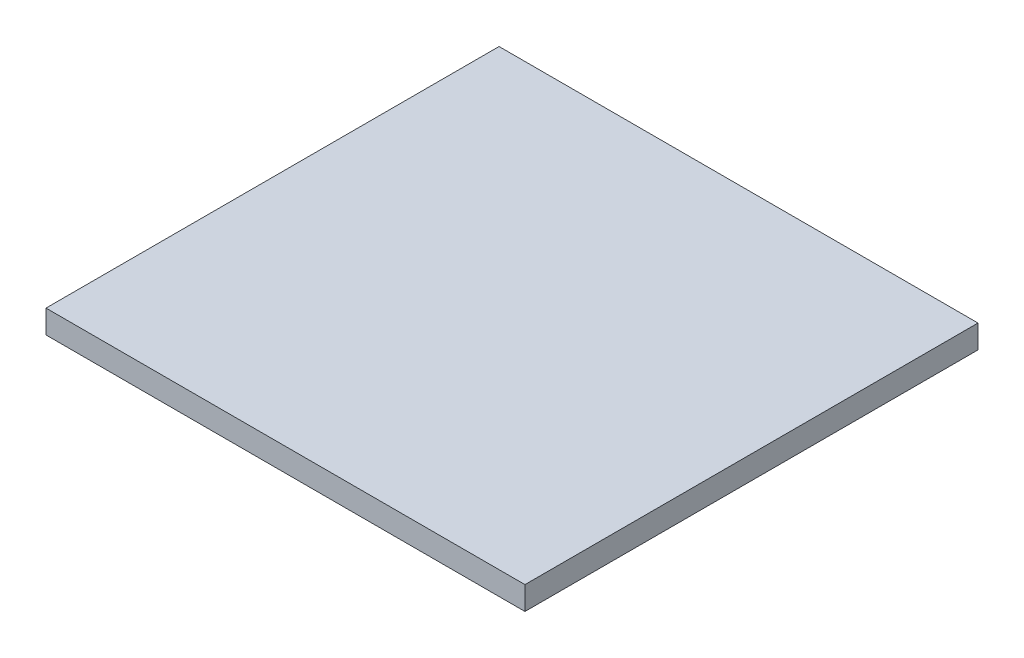
ISO-10303-21;
HEADER;
FILE_DESCRIPTION(('STEP AP214'),'2;1');
FILE_NAME('part.step','',(''),(''),'','','');
FILE_SCHEMA(('AUTOMOTIVE_DESIGN { 1 0 10303 214 1 1 1 1 }'));
ENDSEC;
DATA;
#1=APPLICATION_CONTEXT('core data for automotive mechanical design processes');
#2=APPLICATION_PROTOCOL_DEFINITION('international standard','automotive_design',2000,#1);
#3=PRODUCT_CONTEXT('',#1,'mechanical');
#4=PRODUCT('Part','Part','',(#3));
#5=PRODUCT_RELATED_PRODUCT_CATEGORY('part','',(#4));
#6=PRODUCT_DEFINITION_FORMATION('','',#4);
#7=PRODUCT_DEFINITION_CONTEXT('part definition',#1,'design');
#8=PRODUCT_DEFINITION('design','',#6,#7);
#9=PRODUCT_DEFINITION_SHAPE('','',#8);
#10=(LENGTH_UNIT() NAMED_UNIT(*) SI_UNIT(.MILLI.,.METRE.));
#11=(NAMED_UNIT(*) PLANE_ANGLE_UNIT() SI_UNIT($,.RADIAN.));
#12=(NAMED_UNIT(*) SI_UNIT($,.STERADIAN.) SOLID_ANGLE_UNIT());
#13=UNCERTAINTY_MEASURE_WITH_UNIT(LENGTH_MEASURE(1.E-05),#10,'distance_accuracy_value','');
#14=(GEOMETRIC_REPRESENTATION_CONTEXT(3) GLOBAL_UNCERTAINTY_ASSIGNED_CONTEXT((#13)) GLOBAL_UNIT_ASSIGNED_CONTEXT((#10,
#11,#12)) REPRESENTATION_CONTEXT('',''));
#15=CARTESIAN_POINT('',(0.,0.,0.));
#16=DIRECTION('',(0.,0.,1.));
#17=DIRECTION('',(1.,0.,0.));
#18=AXIS2_PLACEMENT_3D('',#15,#16,#17);
#19=CARTESIAN_POINT('',(0.,0.28,0.));
#20=DIRECTION('',(0.,1.,0.));
#21=DIRECTION('',(1.,0.,0.));
#22=AXIS2_PLACEMENT_3D('',#19,#20,#21);
#23=PLANE('',#22);
#24=DIRECTION('',(0.,0.,1.));
#25=VECTOR('',#24,1.);
#26=CARTESIAN_POINT('',(0.63,0.28,-0.175));
#27=LINE('',#26,#25);
#28=CARTESIAN_POINT('',(0.63,0.28,-0.175));
#29=VERTEX_POINT('',#28);
#30=CARTESIAN_POINT('',(0.63,0.28,0.175));
#31=VERTEX_POINT('',#30);
#32=EDGE_CURVE('E90',#29,#31,#27,.T.);
#33=ORIENTED_EDGE('',*,*,#32,.F.);
#34=DIRECTION('',(-1.,0.,0.));
#35=VECTOR('',#34,1.);
#36=CARTESIAN_POINT('',(0.63,0.28,-0.175));
#37=LINE('',#36,#35);
#38=CARTESIAN_POINT('',(1.,0.28,-0.175));
#39=VERTEX_POINT('',#38);
#40=EDGE_CURVE('E21',#39,#29,#37,.T.);
#41=ORIENTED_EDGE('',*,*,#40,.F.);
#42=DIRECTION('',(0.,0.,-1.));
#43=VECTOR('',#42,1.);
#44=CARTESIAN_POINT('',(1.,0.28,-0.175));
#45=LINE('',#44,#43);
#46=CARTESIAN_POINT('',(1.,0.28,0.175));
#47=VERTEX_POINT('',#46);
#48=EDGE_CURVE('E97',#47,#39,#45,.T.);
#49=ORIENTED_EDGE('',*,*,#48,.F.);
#50=DIRECTION('',(1.,0.,0.));
#51=VECTOR('',#50,1.);
#52=CARTESIAN_POINT('',(0.63,0.28,0.175));
#53=LINE('',#52,#51);
#54=EDGE_CURVE('E79',#31,#47,#53,.T.);
#55=ORIENTED_EDGE('',*,*,#54,.F.);
#56=EDGE_LOOP('',(#33,#41,#49,#55));
#57=FACE_BOUND('',#56,.T.);
#58=ADVANCED_FACE('F17',(#57),#23,.F.);
#59=CARTESIAN_POINT('',(0.,0.298,0.));
#60=DIRECTION('',(0.,1.,0.));
#61=DIRECTION('',(1.,0.,0.));
#62=AXIS2_PLACEMENT_3D('',#59,#60,#61);
#63=PLANE('',#62);
#64=DIRECTION('',(0.,0.,1.));
#65=VECTOR('',#64,1.);
#66=CARTESIAN_POINT('',(0.63,0.298,-0.175));
#67=LINE('',#66,#65);
#68=CARTESIAN_POINT('',(0.63,0.298,-0.175));
#69=VERTEX_POINT('',#68);
#70=CARTESIAN_POINT('',(0.63,0.298,0.175));
#71=VERTEX_POINT('',#70);
#72=EDGE_CURVE('E68',#69,#71,#67,.T.);
#73=ORIENTED_EDGE('',*,*,#72,.T.);
#74=DIRECTION('',(1.,0.,0.));
#75=VECTOR('',#74,1.);
#76=CARTESIAN_POINT('',(0.63,0.298,0.175));
#77=LINE('',#76,#75);
#78=CARTESIAN_POINT('',(1.,0.298,0.175));
#79=VERTEX_POINT('',#78);
#80=EDGE_CURVE('E103',#71,#79,#77,.T.);
#81=ORIENTED_EDGE('',*,*,#80,.T.);
#82=DIRECTION('',(0.,0.,-1.));
#83=VECTOR('',#82,1.);
#84=CARTESIAN_POINT('',(1.,0.298,-0.175));
#85=LINE('',#84,#83);
#86=CARTESIAN_POINT('',(1.,0.298,-0.175));
#87=VERTEX_POINT('',#86);
#88=EDGE_CURVE('E70',#79,#87,#85,.T.);
#89=ORIENTED_EDGE('',*,*,#88,.T.);
#90=DIRECTION('',(-1.,0.,0.));
#91=VECTOR('',#90,1.);
#92=CARTESIAN_POINT('',(0.63,0.298,-0.175));
#93=LINE('',#92,#91);
#94=EDGE_CURVE('E11',#87,#69,#93,.T.);
#95=ORIENTED_EDGE('',*,*,#94,.T.);
#96=EDGE_LOOP('',(#73,#81,#89,#95));
#97=FACE_BOUND('',#96,.T.);
#98=ADVANCED_FACE('F19',(#97),#63,.T.);
#99=CARTESIAN_POINT('',(0.63,0.298,-0.175));
#100=DIRECTION('',(0.,0.,1.));
#101=DIRECTION('',(1.,0.,0.));
#102=AXIS2_PLACEMENT_3D('',#99,#100,#101);
#103=PLANE('',#102);
#104=ORIENTED_EDGE('',*,*,#40,.T.);
#105=DIRECTION('',(0.,-1.,0.));
#106=VECTOR('',#105,1.);
#107=CARTESIAN_POINT('',(0.63,0.298,-0.175));
#108=LINE('',#107,#106);
#109=EDGE_CURVE('E73',#69,#29,#108,.T.);
#110=ORIENTED_EDGE('',*,*,#109,.F.);
#111=ORIENTED_EDGE('',*,*,#94,.F.);
#112=DIRECTION('',(0.,-1.,0.));
#113=VECTOR('',#112,1.);
#114=CARTESIAN_POINT('',(1.,0.298,-0.175));
#115=LINE('',#114,#113);
#116=EDGE_CURVE('E93',#87,#39,#115,.T.);
#117=ORIENTED_EDGE('',*,*,#116,.T.);
#118=EDGE_LOOP('',(#104,#110,#111,#117));
#119=FACE_BOUND('',#118,.T.);
#120=ADVANCED_FACE('F74',(#119),#103,.F.);
#121=CARTESIAN_POINT('',(1.,0.298,-0.175));
#122=DIRECTION('',(-1.,0.,0.));
#123=DIRECTION('',(0.,0.,1.));
#124=AXIS2_PLACEMENT_3D('',#121,#122,#123);
#125=PLANE('',#124);
#126=ORIENTED_EDGE('',*,*,#48,.T.);
#127=ORIENTED_EDGE('',*,*,#116,.F.);
#128=ORIENTED_EDGE('',*,*,#88,.F.);
#129=DIRECTION('',(0.,-1.,0.));
#130=VECTOR('',#129,1.);
#131=CARTESIAN_POINT('',(1.,0.298,0.175));
#132=LINE('',#131,#130);
#133=EDGE_CURVE('E108',#79,#47,#132,.T.);
#134=ORIENTED_EDGE('',*,*,#133,.T.);
#135=EDGE_LOOP('',(#126,#127,#128,#134));
#136=FACE_BOUND('',#135,.T.);
#137=ADVANCED_FACE('F120',(#136),#125,.F.);
#138=CARTESIAN_POINT('',(0.63,0.298,0.175));
#139=DIRECTION('',(0.,0.,-1.));
#140=DIRECTION('',(0.,-1.,0.));
#141=AXIS2_PLACEMENT_3D('',#138,#139,#140);
#142=PLANE('',#141);
#143=ORIENTED_EDGE('',*,*,#54,.T.);
#144=ORIENTED_EDGE('',*,*,#133,.F.);
#145=ORIENTED_EDGE('',*,*,#80,.F.);
#146=DIRECTION('',(0.,-1.,0.));
#147=VECTOR('',#146,1.);
#148=CARTESIAN_POINT('',(0.63,0.298,0.175));
#149=LINE('',#148,#147);
#150=EDGE_CURVE('E83',#71,#31,#149,.T.);
#151=ORIENTED_EDGE('',*,*,#150,.T.);
#152=EDGE_LOOP('',(#143,#144,#145,#151));
#153=FACE_BOUND('',#152,.T.);
#154=ADVANCED_FACE('F118',(#153),#142,.F.);
#155=CARTESIAN_POINT('',(0.63,0.298,-0.175));
#156=DIRECTION('',(1.,0.,0.));
#157=DIRECTION('',(0.,1.,0.));
#158=AXIS2_PLACEMENT_3D('',#155,#156,#157);
#159=PLANE('',#158);
#160=ORIENTED_EDGE('',*,*,#32,.T.);
#161=ORIENTED_EDGE('',*,*,#150,.F.);
#162=ORIENTED_EDGE('',*,*,#72,.F.);
#163=ORIENTED_EDGE('',*,*,#109,.T.);
#164=EDGE_LOOP('',(#160,#161,#162,#163));
#165=FACE_BOUND('',#164,.T.);
#166=ADVANCED_FACE('F81',(#165),#159,.F.);
#167=CLOSED_SHELL('',(#58,#98,#120,#137,#154,#166));
#168=MANIFOLD_SOLID_BREP('B1',#167);
#169=ADVANCED_BREP_SHAPE_REPRESENTATION('',(#18,#168),#14);
#170=SHAPE_DEFINITION_REPRESENTATION(#9,#169);
ENDSEC;
END-ISO-10303-21;
